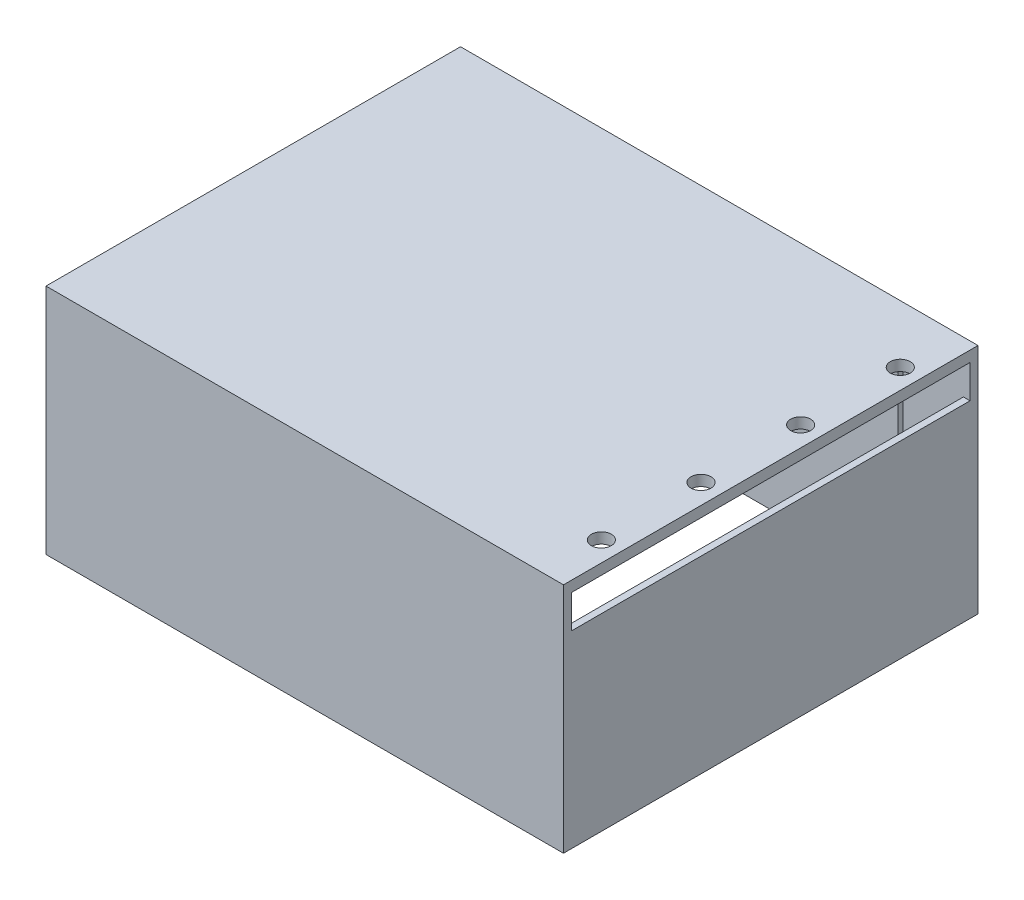
ISO-10303-21;
HEADER;
FILE_DESCRIPTION(('STEP AP214'),'2;1');
FILE_NAME('part.step','',(''),(''),'','','');
FILE_SCHEMA(('AUTOMOTIVE_DESIGN { 1 0 10303 214 1 1 1 1 }'));
ENDSEC;
DATA;
#1=APPLICATION_CONTEXT('core data for automotive mechanical design processes');
#2=APPLICATION_PROTOCOL_DEFINITION('international standard','automotive_design',2000,#1);
#3=PRODUCT_CONTEXT('',#1,'mechanical');
#4=PRODUCT('Part','Part','',(#3));
#5=PRODUCT_RELATED_PRODUCT_CATEGORY('part','',(#4));
#6=PRODUCT_DEFINITION_FORMATION('','',#4);
#7=PRODUCT_DEFINITION_CONTEXT('part definition',#1,'design');
#8=PRODUCT_DEFINITION('design','',#6,#7);
#9=PRODUCT_DEFINITION_SHAPE('','',#8);
#10=(LENGTH_UNIT() NAMED_UNIT(*) SI_UNIT(.MILLI.,.METRE.));
#11=(NAMED_UNIT(*) PLANE_ANGLE_UNIT() SI_UNIT($,.RADIAN.));
#12=(NAMED_UNIT(*) SI_UNIT($,.STERADIAN.) SOLID_ANGLE_UNIT());
#13=UNCERTAINTY_MEASURE_WITH_UNIT(LENGTH_MEASURE(1.E-05),#10,'distance_accuracy_value','');
#14=(GEOMETRIC_REPRESENTATION_CONTEXT(3) GLOBAL_UNCERTAINTY_ASSIGNED_CONTEXT((#13)) GLOBAL_UNIT_ASSIGNED_CONTEXT((#10,
#11,#12)) REPRESENTATION_CONTEXT('',''));
#15=CARTESIAN_POINT('',(0.,0.,0.));
#16=DIRECTION('',(0.,0.,1.));
#17=DIRECTION('',(1.,0.,0.));
#18=AXIS2_PLACEMENT_3D('',#15,#16,#17);
#19=CARTESIAN_POINT('',(0.,0.,0.));
#20=DIRECTION('',(0.,-1.,0.));
#21=DIRECTION('',(0.,0.,-1.));
#22=AXIS2_PLACEMENT_3D('',#19,#20,#21);
#23=PLANE('',#22);
#24=DIRECTION('',(-1.,0.,0.));
#25=VECTOR('',#24,1.);
#26=CARTESIAN_POINT('',(10.,0.,-17.4865255232317));
#27=LINE('',#26,#25);
#28=CARTESIAN_POINT('',(2.,0.,-17.4865255232317));
#29=VERTEX_POINT('',#28);
#30=CARTESIAN_POINT('',(0.,0.,-17.4865255232317));
#31=VERTEX_POINT('',#30);
#32=EDGE_CURVE('E326',#29,#31,#27,.T.);
#33=ORIENTED_EDGE('',*,*,#32,.T.);
#34=DIRECTION('',(0.,0.,1.));
#35=VECTOR('',#34,1.);
#36=CARTESIAN_POINT('',(0.,0.,0.));
#37=LINE('',#36,#35);
#38=CARTESIAN_POINT('',(0.,0.,-35.7665255232317));
#39=VERTEX_POINT('',#38);
#40=EDGE_CURVE('E391',#39,#31,#37,.T.);
#41=ORIENTED_EDGE('',*,*,#40,.F.);
#42=DIRECTION('',(-1.,0.,0.));
#43=VECTOR('',#42,1.);
#44=CARTESIAN_POINT('',(15.,0.,-35.7665255232317));
#45=LINE('',#44,#43);
#46=CARTESIAN_POINT('',(2.,0.,-35.7665255232317));
#47=VERTEX_POINT('',#46);
#48=EDGE_CURVE('E343',#47,#39,#45,.T.);
#49=ORIENTED_EDGE('',*,*,#48,.F.);
#50=DIRECTION('',(0.,0.,-1.));
#51=VECTOR('',#50,1.);
#52=CARTESIAN_POINT('',(2.,0.,0.));
#53=LINE('',#52,#51);
#54=EDGE_CURVE('E369',#29,#47,#53,.T.);
#55=ORIENTED_EDGE('',*,*,#54,.F.);
#56=EDGE_LOOP('',(#33,#41,#49,#55));
#57=FACE_BOUND('',#56,.T.);
#58=ADVANCED_FACE('F46',(#57),#23,.T.);
#59=CARTESIAN_POINT('',(0.,35.,0.));
#60=DIRECTION('',(1.,0.,0.));
#61=DIRECTION('',(0.,0.,-1.));
#62=AXIS2_PLACEMENT_3D('',#59,#60,#61);
#63=PLANE('',#62);
#64=DIRECTION('',(0.,0.,1.));
#65=VECTOR('',#64,1.);
#66=CARTESIAN_POINT('',(0.,9.,-52.4));
#67=LINE('',#66,#65);
#68=CARTESIAN_POINT('',(0.,9.,-52.4));
#69=VERTEX_POINT('',#68);
#70=CARTESIAN_POINT('',(0.,9.,-35.4));
#71=VERTEX_POINT('',#70);
#72=EDGE_CURVE('E300',#69,#71,#67,.T.);
#73=ORIENTED_EDGE('',*,*,#72,.F.);
#74=DIRECTION('',(0.,-1.,0.));
#75=VECTOR('',#74,1.);
#76=CARTESIAN_POINT('',(0.,25.,-52.4));
#77=LINE('',#76,#75);
#78=CARTESIAN_POINT('',(0.,25.,-52.4));
#79=VERTEX_POINT('',#78);
#80=EDGE_CURVE('E293',#79,#69,#77,.T.);
#81=ORIENTED_EDGE('',*,*,#80,.F.);
#82=DIRECTION('',(0.,0.,-1.));
#83=VECTOR('',#82,1.);
#84=CARTESIAN_POINT('',(0.,25.,-52.4));
#85=LINE('',#84,#83);
#86=CARTESIAN_POINT('',(0.,25.,-35.4));
#87=VERTEX_POINT('',#86);
#88=EDGE_CURVE('E306',#87,#79,#85,.T.);
#89=ORIENTED_EDGE('',*,*,#88,.F.);
#90=DIRECTION('',(0.,1.,0.));
#91=VECTOR('',#90,1.);
#92=CARTESIAN_POINT('',(0.,25.,-35.4));
#93=LINE('',#92,#91);
#94=EDGE_CURVE('E303',#71,#87,#93,.T.);
#95=ORIENTED_EDGE('',*,*,#94,.F.);
#96=EDGE_LOOP('',(#73,#81,#89,#95));
#97=FACE_BOUND('',#96,.T.);
#98=ORIENTED_EDGE('',*,*,#40,.T.);
#99=DIRECTION('',(0.,-1.,0.));
#100=VECTOR('',#99,1.);
#101=CARTESIAN_POINT('',(0.,0.,-17.4865255232317));
#102=LINE('',#101,#100);
#103=CARTESIAN_POINT('',(0.,5.15,-17.4865255232317));
#104=VERTEX_POINT('',#103);
#105=EDGE_CURVE('E312',#104,#31,#102,.T.);
#106=ORIENTED_EDGE('',*,*,#105,.F.);
#107=DIRECTION('',(0.,0.,-1.));
#108=VECTOR('',#107,1.);
#109=CARTESIAN_POINT('',(0.,5.15,-17.4865255232317));
#110=LINE('',#109,#108);
#111=CARTESIAN_POINT('',(0.,5.15,-7.52999999999999));
#112=VERTEX_POINT('',#111);
#113=EDGE_CURVE('E323',#112,#104,#110,.T.);
#114=ORIENTED_EDGE('',*,*,#113,.F.);
#115=DIRECTION('',(0.,1.,0.));
#116=VECTOR('',#115,1.);
#117=CARTESIAN_POINT('',(0.,0.,-7.52999999999999));
#118=LINE('',#117,#116);
#119=CARTESIAN_POINT('',(0.,0.,-7.52999999999999));
#120=VERTEX_POINT('',#119);
#121=EDGE_CURVE('E320',#120,#112,#118,.T.);
#122=ORIENTED_EDGE('',*,*,#121,.F.);
#123=CARTESIAN_POINT('',(0.,0.,0.));
#124=VERTEX_POINT('',#123);
#125=EDGE_CURVE('E373',#120,#124,#37,.T.);
#126=ORIENTED_EDGE('',*,*,#125,.T.);
#127=DIRECTION('',(0.,-1.,0.));
#128=VECTOR('',#127,1.);
#129=CARTESIAN_POINT('',(0.,35.,0.));
#130=LINE('',#129,#128);
#131=CARTESIAN_POINT('',(0.,35.,0.));
#132=VERTEX_POINT('',#131);
#133=EDGE_CURVE('E404',#132,#124,#130,.T.);
#134=ORIENTED_EDGE('',*,*,#133,.F.);
#135=DIRECTION('',(0.,0.,1.));
#136=VECTOR('',#135,1.);
#137=CARTESIAN_POINT('',(0.,35.,0.));
#138=LINE('',#137,#136);
#139=CARTESIAN_POINT('',(0.,35.,-62.4));
#140=VERTEX_POINT('',#139);
#141=EDGE_CURVE('E376',#140,#132,#138,.T.);
#142=ORIENTED_EDGE('',*,*,#141,.F.);
#143=DIRECTION('',(0.,-1.,0.));
#144=VECTOR('',#143,1.);
#145=CARTESIAN_POINT('',(0.,35.,-62.4));
#146=LINE('',#145,#144);
#147=CARTESIAN_POINT('',(0.,0.,-62.4));
#148=VERTEX_POINT('',#147);
#149=EDGE_CURVE('E386',#140,#148,#146,.T.);
#150=ORIENTED_EDGE('',*,*,#149,.T.);
#151=CARTESIAN_POINT('',(0.,0.,-48.9));
#152=VERTEX_POINT('',#151);
#153=EDGE_CURVE('E387',#148,#152,#37,.T.);
#154=ORIENTED_EDGE('',*,*,#153,.T.);
#155=DIRECTION('',(0.,-1.,0.));
#156=VECTOR('',#155,1.);
#157=CARTESIAN_POINT('',(0.,0.,-48.9));
#158=LINE('',#157,#156);
#159=CARTESIAN_POINT('',(0.,5.,-48.9));
#160=VERTEX_POINT('',#159);
#161=EDGE_CURVE('E341',#160,#152,#158,.T.);
#162=ORIENTED_EDGE('',*,*,#161,.F.);
#163=DIRECTION('',(0.,0.,-1.));
#164=VECTOR('',#163,1.);
#165=CARTESIAN_POINT('',(0.,5.,-35.7665255232317));
#166=LINE('',#165,#164);
#167=CARTESIAN_POINT('',(0.,5.,-35.7665255232317));
#168=VERTEX_POINT('',#167);
#169=EDGE_CURVE('E338',#168,#160,#166,.T.);
#170=ORIENTED_EDGE('',*,*,#169,.F.);
#171=DIRECTION('',(0.,1.,0.));
#172=VECTOR('',#171,1.);
#173=CARTESIAN_POINT('',(0.,0.,-35.7665255232317));
#174=LINE('',#173,#172);
#175=EDGE_CURVE('E329',#39,#168,#174,.T.);
#176=ORIENTED_EDGE('',*,*,#175,.F.);
#177=EDGE_LOOP('',(#98,#106,#114,#122,#126,#134,#142,#150,#154,#162,#170,#176));
#178=FACE_BOUND('',#177,.T.);
#179=ADVANCED_FACE('F48',(#97,#178),#63,.F.);
#180=CARTESIAN_POINT('',(0.,35.,0.));
#181=DIRECTION('',(0.,0.,-1.));
#182=DIRECTION('',(-1.,0.,0.));
#183=AXIS2_PLACEMENT_3D('',#180,#181,#182);
#184=PLANE('',#183);
#185=DIRECTION('',(1.,0.,0.));
#186=VECTOR('',#185,1.);
#187=CARTESIAN_POINT('',(0.,0.,0.));
#188=LINE('',#187,#186);
#189=CARTESIAN_POINT('',(77.9,0.,0.));
#190=VERTEX_POINT('',#189);
#191=EDGE_CURVE('E390',#124,#190,#188,.T.);
#192=ORIENTED_EDGE('',*,*,#191,.T.);
#193=DIRECTION('',(0.,-1.,0.));
#194=VECTOR('',#193,1.);
#195=CARTESIAN_POINT('',(77.9,35.,0.));
#196=LINE('',#195,#194);
#197=CARTESIAN_POINT('',(77.9,35.,0.));
#198=VERTEX_POINT('',#197);
#199=EDGE_CURVE('E401',#198,#190,#196,.T.);
#200=ORIENTED_EDGE('',*,*,#199,.F.);
#201=DIRECTION('',(1.,0.,0.));
#202=VECTOR('',#201,1.);
#203=CARTESIAN_POINT('',(0.,35.,0.));
#204=LINE('',#203,#202);
#205=EDGE_CURVE('E379',#132,#198,#204,.T.);
#206=ORIENTED_EDGE('',*,*,#205,.F.);
#207=ORIENTED_EDGE('',*,*,#133,.T.);
#208=EDGE_LOOP('',(#192,#200,#206,#207));
#209=FACE_BOUND('',#208,.T.);
#210=ADVANCED_FACE('F461',(#209),#184,.F.);
#211=CARTESIAN_POINT('',(77.9,35.,0.));
#212=DIRECTION('',(-1.,0.,0.));
#213=DIRECTION('',(0.,0.,1.));
#214=AXIS2_PLACEMENT_3D('',#211,#212,#213);
#215=PLANE('',#214);
#216=DIRECTION('',(0.,0.,1.));
#217=VECTOR('',#216,1.);
#218=CARTESIAN_POINT('',(77.9,33.39,-61.2));
#219=LINE('',#218,#217);
#220=CARTESIAN_POINT('',(77.9,33.39,-61.2));
#221=VERTEX_POINT('',#220);
#222=CARTESIAN_POINT('',(77.9,33.39,-1.20000000000001));
#223=VERTEX_POINT('',#222);
#224=EDGE_CURVE('E281',#221,#223,#219,.T.);
#225=ORIENTED_EDGE('',*,*,#224,.F.);
#226=DIRECTION('',(0.,1.,0.));
#227=VECTOR('',#226,1.);
#228=CARTESIAN_POINT('',(77.9,33.39,-61.2));
#229=LINE('',#228,#227);
#230=CARTESIAN_POINT('',(77.9,28.39,-61.2));
#231=VERTEX_POINT('',#230);
#232=EDGE_CURVE('E278',#231,#221,#229,.T.);
#233=ORIENTED_EDGE('',*,*,#232,.F.);
#234=DIRECTION('',(0.,0.,-1.));
#235=VECTOR('',#234,1.);
#236=CARTESIAN_POINT('',(77.9,28.39,-61.2));
#237=LINE('',#236,#235);
#238=CARTESIAN_POINT('',(77.9,28.39,-1.20000000000001));
#239=VERTEX_POINT('',#238);
#240=EDGE_CURVE('E287',#239,#231,#237,.T.);
#241=ORIENTED_EDGE('',*,*,#240,.F.);
#242=DIRECTION('',(0.,-1.,0.));
#243=VECTOR('',#242,1.);
#244=CARTESIAN_POINT('',(77.9,33.39,-1.20000000000001));
#245=LINE('',#244,#243);
#246=EDGE_CURVE('E284',#223,#239,#245,.T.);
#247=ORIENTED_EDGE('',*,*,#246,.F.);
#248=EDGE_LOOP('',(#225,#233,#241,#247));
#249=FACE_BOUND('',#248,.T.);
#250=DIRECTION('',(0.,0.,-1.));
#251=VECTOR('',#250,1.);
#252=CARTESIAN_POINT('',(77.9,0.,0.));
#253=LINE('',#252,#251);
#254=CARTESIAN_POINT('',(77.9,0.,-62.4));
#255=VERTEX_POINT('',#254);
#256=EDGE_CURVE('E393',#190,#255,#253,.T.);
#257=ORIENTED_EDGE('',*,*,#256,.T.);
#258=DIRECTION('',(0.,-1.,0.));
#259=VECTOR('',#258,1.);
#260=CARTESIAN_POINT('',(77.9,35.,-62.4));
#261=LINE('',#260,#259);
#262=CARTESIAN_POINT('',(77.9,35.,-62.4));
#263=VERTEX_POINT('',#262);
#264=EDGE_CURVE('E398',#263,#255,#261,.T.);
#265=ORIENTED_EDGE('',*,*,#264,.F.);
#266=DIRECTION('',(0.,0.,-1.));
#267=VECTOR('',#266,1.);
#268=CARTESIAN_POINT('',(77.9,35.,0.));
#269=LINE('',#268,#267);
#270=EDGE_CURVE('E382',#198,#263,#269,.T.);
#271=ORIENTED_EDGE('',*,*,#270,.F.);
#272=ORIENTED_EDGE('',*,*,#199,.T.);
#273=EDGE_LOOP('',(#257,#265,#271,#272));
#274=FACE_BOUND('',#273,.T.);
#275=ADVANCED_FACE('F479',(#249,#274),#215,.F.);
#276=CARTESIAN_POINT('',(0.,35.,-62.4));
#277=DIRECTION('',(0.,0.,1.));
#278=DIRECTION('',(1.,0.,0.));
#279=AXIS2_PLACEMENT_3D('',#276,#277,#278);
#280=PLANE('',#279);
#281=DIRECTION('',(-1.,0.,0.));
#282=VECTOR('',#281,1.);
#283=CARTESIAN_POINT('',(0.,0.,-62.4));
#284=LINE('',#283,#282);
#285=EDGE_CURVE('E380',#255,#148,#284,.T.);
#286=ORIENTED_EDGE('',*,*,#285,.T.);
#287=ORIENTED_EDGE('',*,*,#149,.F.);
#288=DIRECTION('',(-1.,0.,0.));
#289=VECTOR('',#288,1.);
#290=CARTESIAN_POINT('',(0.,35.,-62.4));
#291=LINE('',#290,#289);
#292=EDGE_CURVE('E384',#263,#140,#291,.T.);
#293=ORIENTED_EDGE('',*,*,#292,.F.);
#294=ORIENTED_EDGE('',*,*,#264,.T.);
#295=EDGE_LOOP('',(#286,#287,#293,#294));
#296=FACE_BOUND('',#295,.T.);
#297=ADVANCED_FACE('F474',(#296),#280,.F.);
#298=CARTESIAN_POINT('',(0.,35.,0.));
#299=DIRECTION('',(0.,-1.,0.));
#300=DIRECTION('',(0.,0.,-1.));
#301=AXIS2_PLACEMENT_3D('',#298,#299,#300);
#302=PLANE('',#301);
#303=CARTESIAN_POINT('',(74.9,35.,-8.7));
#304=DIRECTION('',(0.,-1.,0.));
#305=DIRECTION('',(0.,0.,-1.));
#306=AXIS2_PLACEMENT_3D('',#303,#304,#305);
#307=CIRCLE('',#306,1.5);
#308=CARTESIAN_POINT('',(74.9,35.,-10.2));
#309=VERTEX_POINT('',#308);
#310=EDGE_CURVE('E243',#309,#309,#307,.T.);
#311=ORIENTED_EDGE('',*,*,#310,.T.);
#312=EDGE_LOOP('',(#311));
#313=FACE_BOUND('',#312,.T.);
#314=CARTESIAN_POINT('',(74.9,35.,-23.7));
#315=DIRECTION('',(0.,-1.,0.));
#316=DIRECTION('',(0.,0.,-1.));
#317=AXIS2_PLACEMENT_3D('',#314,#315,#316);
#318=CIRCLE('',#317,1.5);
#319=CARTESIAN_POINT('',(74.9,35.,-25.2));
#320=VERTEX_POINT('',#319);
#321=EDGE_CURVE('E606',#320,#320,#318,.T.);
#322=ORIENTED_EDGE('',*,*,#321,.T.);
#323=EDGE_LOOP('',(#322));
#324=FACE_BOUND('',#323,.T.);
#325=CARTESIAN_POINT('',(74.9,35.,-38.7));
#326=DIRECTION('',(0.,-1.,0.));
#327=DIRECTION('',(0.,0.,-1.));
#328=AXIS2_PLACEMENT_3D('',#325,#326,#327);
#329=CIRCLE('',#328,1.5);
#330=CARTESIAN_POINT('',(74.9,35.,-40.2));
#331=VERTEX_POINT('',#330);
#332=EDGE_CURVE('E603',#331,#331,#329,.T.);
#333=ORIENTED_EDGE('',*,*,#332,.T.);
#334=EDGE_LOOP('',(#333));
#335=FACE_BOUND('',#334,.T.);
#336=CARTESIAN_POINT('',(74.9,35.,-53.7));
#337=DIRECTION('',(0.,-1.,0.));
#338=DIRECTION('',(0.,0.,-1.));
#339=AXIS2_PLACEMENT_3D('',#336,#337,#338);
#340=CIRCLE('',#339,1.5);
#341=CARTESIAN_POINT('',(74.9,35.,-55.2));
#342=VERTEX_POINT('',#341);
#343=EDGE_CURVE('E592',#342,#342,#340,.T.);
#344=ORIENTED_EDGE('',*,*,#343,.T.);
#345=EDGE_LOOP('',(#344));
#346=FACE_BOUND('',#345,.T.);
#347=ORIENTED_EDGE('',*,*,#141,.T.);
#348=ORIENTED_EDGE('',*,*,#205,.T.);
#349=ORIENTED_EDGE('',*,*,#270,.T.);
#350=ORIENTED_EDGE('',*,*,#292,.T.);
#351=EDGE_LOOP('',(#347,#348,#349,#350));
#352=FACE_BOUND('',#351,.T.);
#353=ADVANCED_FACE('F467',(#313,#324,#335,#346,#352),#302,.F.);
#354=DIRECTION('',(-1.,0.,0.));
#355=VECTOR('',#354,1.);
#356=CARTESIAN_POINT('',(76.9,0.,-1.20000000000001));
#357=LINE('',#356,#355);
#358=CARTESIAN_POINT('',(75.294254170899,0.,-1.20000000000001));
#359=VERTEX_POINT('',#358);
#360=CARTESIAN_POINT('',(67.8234145179937,0.,-1.20000000000001));
#361=VERTEX_POINT('',#360);
#362=EDGE_CURVE('E232',#359,#361,#357,.T.);
#363=ORIENTED_EDGE('',*,*,#362,.F.);
#364=DIRECTION('',(0.,0.,-1.));
#365=VECTOR('',#364,1.);
#366=CARTESIAN_POINT('',(75.294254170899,0.,-1.20000000000001));
#367=LINE('',#366,#365);
#368=CARTESIAN_POINT('',(75.294254170899,0.,-61.2));
#369=VERTEX_POINT('',#368);
#370=EDGE_CURVE('E434',#359,#369,#367,.T.);
#371=ORIENTED_EDGE('',*,*,#370,.T.);
#372=DIRECTION('',(1.,0.,0.));
#373=VECTOR('',#372,1.);
#374=CARTESIAN_POINT('',(76.9,0.,-61.2));
#375=LINE('',#374,#373);
#376=CARTESIAN_POINT('',(67.8234145179937,0.,-61.2));
#377=VERTEX_POINT('',#376);
#378=EDGE_CURVE('E68',#377,#369,#375,.T.);
#379=ORIENTED_EDGE('',*,*,#378,.F.);
#380=DIRECTION('',(0.,0.,-1.));
#381=VECTOR('',#380,1.);
#382=CARTESIAN_POINT('',(67.8234145179937,0.,-61.2));
#383=LINE('',#382,#381);
#384=CARTESIAN_POINT('',(67.8234145179937,0.,-60.4));
#385=VERTEX_POINT('',#384);
#386=EDGE_CURVE('E242',#385,#377,#383,.T.);
#387=ORIENTED_EDGE('',*,*,#386,.F.);
#388=DIRECTION('',(1.,0.,0.));
#389=VECTOR('',#388,1.);
#390=CARTESIAN_POINT('',(0.,0.,-60.4));
#391=LINE('',#390,#389);
#392=CARTESIAN_POINT('',(2.,0.,-60.4));
#393=VERTEX_POINT('',#392);
#394=EDGE_CURVE('E347',#393,#385,#391,.T.);
#395=ORIENTED_EDGE('',*,*,#394,.F.);
#396=CARTESIAN_POINT('',(2.,0.,-48.9));
#397=VERTEX_POINT('',#396);
#398=EDGE_CURVE('E366',#397,#393,#53,.T.);
#399=ORIENTED_EDGE('',*,*,#398,.F.);
#400=DIRECTION('',(-1.,0.,0.));
#401=VECTOR('',#400,1.);
#402=CARTESIAN_POINT('',(15.,0.,-48.9));
#403=LINE('',#402,#401);
#404=EDGE_CURVE('E344',#397,#152,#403,.T.);
#405=ORIENTED_EDGE('',*,*,#404,.T.);
#406=ORIENTED_EDGE('',*,*,#153,.F.);
#407=ORIENTED_EDGE('',*,*,#285,.F.);
#408=ORIENTED_EDGE('',*,*,#256,.F.);
#409=ORIENTED_EDGE('',*,*,#191,.F.);
#410=ORIENTED_EDGE('',*,*,#125,.F.);
#411=DIRECTION('',(-1.,0.,0.));
#412=VECTOR('',#411,1.);
#413=CARTESIAN_POINT('',(10.,0.,-7.52999999999999));
#414=LINE('',#413,#412);
#415=CARTESIAN_POINT('',(2.,0.,-7.52999999999999));
#416=VERTEX_POINT('',#415);
#417=EDGE_CURVE('E332',#416,#120,#414,.T.);
#418=ORIENTED_EDGE('',*,*,#417,.F.);
#419=CARTESIAN_POINT('',(2.,0.,-2.));
#420=VERTEX_POINT('',#419);
#421=EDGE_CURVE('E357',#420,#416,#53,.T.);
#422=ORIENTED_EDGE('',*,*,#421,.F.);
#423=DIRECTION('',(-1.,0.,0.));
#424=VECTOR('',#423,1.);
#425=CARTESIAN_POINT('',(0.,0.,-2.));
#426=LINE('',#425,#424);
#427=CARTESIAN_POINT('',(67.8234145179937,0.,-2.00000000000002));
#428=VERTEX_POINT('',#427);
#429=EDGE_CURVE('E258',#428,#420,#426,.T.);
#430=ORIENTED_EDGE('',*,*,#429,.F.);
#431=EDGE_CURVE('E248',#361,#428,#383,.T.);
#432=ORIENTED_EDGE('',*,*,#431,.F.);
#433=EDGE_LOOP('',(#363,#371,#379,#387,#395,#399,#405,#406,#407,#408,#409,#410,#418,#422,#430,#432));
#434=FACE_BOUND('',#433,.T.);
#435=ADVANCED_FACE('F256',(#434),#23,.T.);
#436=CARTESIAN_POINT('',(0.,33.39,-60.4));
#437=DIRECTION('',(0.,0.,-1.));
#438=DIRECTION('',(-1.,0.,0.));
#439=AXIS2_PLACEMENT_3D('',#436,#437,#438);
#440=PLANE('',#439);
#441=ORIENTED_EDGE('',*,*,#394,.T.);
#442=DIRECTION('',(0.,1.,0.));
#443=VECTOR('',#442,1.);
#444=CARTESIAN_POINT('',(67.8234145179937,33.39,-60.4));
#445=LINE('',#444,#443);
#446=CARTESIAN_POINT('',(67.8234145179937,33.39,-60.4));
#447=VERTEX_POINT('',#446);
#448=EDGE_CURVE('E275',#385,#447,#445,.T.);
#449=ORIENTED_EDGE('',*,*,#448,.T.);
#450=DIRECTION('',(1.,0.,0.));
#451=VECTOR('',#450,1.);
#452=CARTESIAN_POINT('',(0.,33.39,-60.4));
#453=LINE('',#452,#451);
#454=CARTESIAN_POINT('',(2.,33.39,-60.4));
#455=VERTEX_POINT('',#454);
#456=EDGE_CURVE('E353',#455,#447,#453,.T.);
#457=ORIENTED_EDGE('',*,*,#456,.F.);
#458=DIRECTION('',(0.,-1.,0.));
#459=VECTOR('',#458,1.);
#460=CARTESIAN_POINT('',(2.,33.39,-60.4));
#461=LINE('',#460,#459);
#462=EDGE_CURVE('E370',#455,#393,#461,.T.);
#463=ORIENTED_EDGE('',*,*,#462,.T.);
#464=EDGE_LOOP('',(#441,#449,#457,#463));
#465=FACE_BOUND('',#464,.T.);
#466=ADVANCED_FACE('F466',(#465),#440,.F.);
#467=CARTESIAN_POINT('',(2.,33.39,0.));
#468=DIRECTION('',(-1.,0.,0.));
#469=DIRECTION('',(0.,0.,1.));
#470=AXIS2_PLACEMENT_3D('',#467,#468,#469);
#471=PLANE('',#470);
#472=CARTESIAN_POINT('',(2.,2.5,-31.2));
#473=DIRECTION('',(-1.,0.,0.));
#474=DIRECTION('',(0.,0.,1.));
#475=AXIS2_PLACEMENT_3D('',#472,#473,#474);
#476=CIRCLE('',#475,1.);
#477=CARTESIAN_POINT('',(2.,2.5,-30.2));
#478=VERTEX_POINT('',#477);
#479=EDGE_CURVE('E50',#478,#478,#476,.T.);
#480=ORIENTED_EDGE('',*,*,#479,.T.);
#481=EDGE_LOOP('',(#480));
#482=FACE_BOUND('',#481,.T.);
#483=DIRECTION('',(0.,0.,-1.));
#484=VECTOR('',#483,1.);
#485=CARTESIAN_POINT('',(2.,25.,0.));
#486=LINE('',#485,#484);
#487=CARTESIAN_POINT('',(2.,25.,-35.4));
#488=VERTEX_POINT('',#487);
#489=CARTESIAN_POINT('',(2.,25.,-52.4));
#490=VERTEX_POINT('',#489);
#491=EDGE_CURVE('E55',#488,#490,#486,.T.);
#492=ORIENTED_EDGE('',*,*,#491,.T.);
#493=DIRECTION('',(0.,-1.,0.));
#494=VECTOR('',#493,1.);
#495=CARTESIAN_POINT('',(2.,33.39,-52.4));
#496=LINE('',#495,#494);
#497=CARTESIAN_POINT('',(2.,9.,-52.4));
#498=VERTEX_POINT('',#497);
#499=EDGE_CURVE('E13',#490,#498,#496,.T.);
#500=ORIENTED_EDGE('',*,*,#499,.T.);
#501=DIRECTION('',(0.,0.,1.));
#502=VECTOR('',#501,1.);
#503=CARTESIAN_POINT('',(2.,9.00000000000001,0.));
#504=LINE('',#503,#502);
#505=CARTESIAN_POINT('',(2.,9.,-35.4));
#506=VERTEX_POINT('',#505);
#507=EDGE_CURVE('E425',#498,#506,#504,.T.);
#508=ORIENTED_EDGE('',*,*,#507,.T.);
#509=DIRECTION('',(0.,1.,0.));
#510=VECTOR('',#509,1.);
#511=CARTESIAN_POINT('',(2.,33.39,-35.4));
#512=LINE('',#511,#510);
#513=EDGE_CURVE('E428',#506,#488,#512,.T.);
#514=ORIENTED_EDGE('',*,*,#513,.T.);
#515=EDGE_LOOP('',(#492,#500,#508,#514));
#516=FACE_BOUND('',#515,.T.);
#517=DIRECTION('',(0.,0.,-1.));
#518=VECTOR('',#517,1.);
#519=CARTESIAN_POINT('',(2.,5.15,0.));
#520=LINE('',#519,#518);
#521=CARTESIAN_POINT('',(2.,5.15,-7.52999999999999));
#522=VERTEX_POINT('',#521);
#523=CARTESIAN_POINT('',(2.,5.15,-17.4865255232317));
#524=VERTEX_POINT('',#523);
#525=EDGE_CURVE('E419',#522,#524,#520,.T.);
#526=ORIENTED_EDGE('',*,*,#525,.T.);
#527=DIRECTION('',(0.,-1.,0.));
#528=VECTOR('',#527,1.);
#529=CARTESIAN_POINT('',(2.,33.39,-17.4865255232317));
#530=LINE('',#529,#528);
#531=EDGE_CURVE('E422',#524,#29,#530,.T.);
#532=ORIENTED_EDGE('',*,*,#531,.T.);
#533=ORIENTED_EDGE('',*,*,#54,.T.);
#534=DIRECTION('',(0.,1.,0.));
#535=VECTOR('',#534,1.);
#536=CARTESIAN_POINT('',(2.,33.39,-35.7665255232317));
#537=LINE('',#536,#535);
#538=CARTESIAN_POINT('',(2.,5.,-35.7665255232317));
#539=VERTEX_POINT('',#538);
#540=EDGE_CURVE('E407',#47,#539,#537,.T.);
#541=ORIENTED_EDGE('',*,*,#540,.T.);
#542=DIRECTION('',(0.,0.,-1.));
#543=VECTOR('',#542,1.);
#544=CARTESIAN_POINT('',(2.,5.,0.));
#545=LINE('',#544,#543);
#546=CARTESIAN_POINT('',(2.,5.,-48.9));
#547=VERTEX_POINT('',#546);
#548=EDGE_CURVE('E410',#539,#547,#545,.T.);
#549=ORIENTED_EDGE('',*,*,#548,.T.);
#550=DIRECTION('',(0.,-1.,0.));
#551=VECTOR('',#550,1.);
#552=CARTESIAN_POINT('',(2.,33.39,-48.9));
#553=LINE('',#552,#551);
#554=EDGE_CURVE('E413',#547,#397,#553,.T.);
#555=ORIENTED_EDGE('',*,*,#554,.T.);
#556=ORIENTED_EDGE('',*,*,#398,.T.);
#557=ORIENTED_EDGE('',*,*,#462,.F.);
#558=DIRECTION('',(0.,0.,-1.));
#559=VECTOR('',#558,1.);
#560=CARTESIAN_POINT('',(2.,33.39,0.));
#561=LINE('',#560,#559);
#562=CARTESIAN_POINT('',(2.,33.39,-2.));
#563=VERTEX_POINT('',#562);
#564=EDGE_CURVE('E359',#563,#455,#561,.T.);
#565=ORIENTED_EDGE('',*,*,#564,.F.);
#566=DIRECTION('',(0.,-1.,0.));
#567=VECTOR('',#566,1.);
#568=CARTESIAN_POINT('',(2.,33.39,-2.));
#569=LINE('',#568,#567);
#570=EDGE_CURVE('E362',#563,#420,#569,.T.);
#571=ORIENTED_EDGE('',*,*,#570,.T.);
#572=ORIENTED_EDGE('',*,*,#421,.T.);
#573=DIRECTION('',(0.,1.,0.));
#574=VECTOR('',#573,1.);
#575=CARTESIAN_POINT('',(2.,33.39,-7.52999999999999));
#576=LINE('',#575,#574);
#577=EDGE_CURVE('E416',#416,#522,#576,.T.);
#578=ORIENTED_EDGE('',*,*,#577,.T.);
#579=EDGE_LOOP('',(#526,#532,#533,#541,#549,#555,#556,#557,#565,#571,#572,#578));
#580=FACE_BOUND('',#579,.T.);
#581=ADVANCED_FACE('F442',(#482,#516,#580),#471,.F.);
#582=CARTESIAN_POINT('',(0.,33.39,-2.));
#583=DIRECTION('',(0.,0.,1.));
#584=DIRECTION('',(1.,0.,0.));
#585=AXIS2_PLACEMENT_3D('',#582,#583,#584);
#586=PLANE('',#585);
#587=DIRECTION('',(-1.,0.,0.));
#588=VECTOR('',#587,1.);
#589=CARTESIAN_POINT('',(0.,33.39,-2.));
#590=LINE('',#589,#588);
#591=CARTESIAN_POINT('',(67.8234145179937,33.39,-2.));
#592=VERTEX_POINT('',#591);
#593=EDGE_CURVE('E356',#592,#563,#590,.T.);
#594=ORIENTED_EDGE('',*,*,#593,.F.);
#595=DIRECTION('',(0.,-1.,0.));
#596=VECTOR('',#595,1.);
#597=CARTESIAN_POINT('',(67.8234145179937,33.39,-2.));
#598=LINE('',#597,#596);
#599=EDGE_CURVE('E272',#592,#428,#598,.T.);
#600=ORIENTED_EDGE('',*,*,#599,.T.);
#601=ORIENTED_EDGE('',*,*,#429,.T.);
#602=ORIENTED_EDGE('',*,*,#570,.F.);
#603=EDGE_LOOP('',(#594,#600,#601,#602));
#604=FACE_BOUND('',#603,.T.);
#605=ADVANCED_FACE('F484',(#604),#586,.F.);
#606=CARTESIAN_POINT('',(0.,33.39,0.));
#607=DIRECTION('',(0.,-1.,0.));
#608=DIRECTION('',(0.,0.,-1.));
#609=AXIS2_PLACEMENT_3D('',#606,#607,#608);
#610=PLANE('',#609);
#611=CARTESIAN_POINT('',(74.9,33.39,-8.7));
#612=DIRECTION('',(0.,-1.,0.));
#613=DIRECTION('',(0.,0.,-1.));
#614=AXIS2_PLACEMENT_3D('',#611,#612,#613);
#615=CIRCLE('',#614,1.5);
#616=CARTESIAN_POINT('',(74.9,33.39,-10.2));
#617=VERTEX_POINT('',#616);
#618=EDGE_CURVE('E589',#617,#617,#615,.T.);
#619=ORIENTED_EDGE('',*,*,#618,.F.);
#620=EDGE_LOOP('',(#619));
#621=FACE_BOUND('',#620,.T.);
#622=CARTESIAN_POINT('',(74.9,33.39,-23.7));
#623=DIRECTION('',(0.,-1.,0.));
#624=DIRECTION('',(0.,0.,-1.));
#625=AXIS2_PLACEMENT_3D('',#622,#623,#624);
#626=CIRCLE('',#625,1.5);
#627=CARTESIAN_POINT('',(74.9,33.39,-25.2));
#628=VERTEX_POINT('',#627);
#629=EDGE_CURVE('E593',#628,#628,#626,.T.);
#630=ORIENTED_EDGE('',*,*,#629,.F.);
#631=EDGE_LOOP('',(#630));
#632=FACE_BOUND('',#631,.T.);
#633=CARTESIAN_POINT('',(74.9,33.39,-38.7));
#634=DIRECTION('',(0.,-1.,0.));
#635=DIRECTION('',(0.,0.,-1.));
#636=AXIS2_PLACEMENT_3D('',#633,#634,#635);
#637=CIRCLE('',#636,1.5);
#638=CARTESIAN_POINT('',(74.9,33.39,-40.2));
#639=VERTEX_POINT('',#638);
#640=EDGE_CURVE('E596',#639,#639,#637,.T.);
#641=ORIENTED_EDGE('',*,*,#640,.F.);
#642=EDGE_LOOP('',(#641));
#643=FACE_BOUND('',#642,.T.);
#644=CARTESIAN_POINT('',(74.9,33.39,-53.7));
#645=DIRECTION('',(0.,-1.,0.));
#646=DIRECTION('',(0.,0.,-1.));
#647=AXIS2_PLACEMENT_3D('',#644,#645,#646);
#648=CIRCLE('',#647,1.5);
#649=CARTESIAN_POINT('',(74.9,33.39,-55.2));
#650=VERTEX_POINT('',#649);
#651=EDGE_CURVE('E587',#650,#650,#648,.T.);
#652=ORIENTED_EDGE('',*,*,#651,.F.);
#653=EDGE_LOOP('',(#652));
#654=FACE_BOUND('',#653,.T.);
#655=ORIENTED_EDGE('',*,*,#456,.T.);
#656=DIRECTION('',(0.,0.,1.));
#657=VECTOR('',#656,1.);
#658=CARTESIAN_POINT('',(67.8234145179937,33.39,-61.2));
#659=LINE('',#658,#657);
#660=CARTESIAN_POINT('',(67.8234145179937,33.39,-61.2));
#661=VERTEX_POINT('',#660);
#662=EDGE_CURVE('E273',#661,#447,#659,.T.);
#663=ORIENTED_EDGE('',*,*,#662,.F.);
#664=DIRECTION('',(1.,0.,0.));
#665=VECTOR('',#664,1.);
#666=CARTESIAN_POINT('',(67.9,33.39,-61.2));
#667=LINE('',#666,#665);
#668=EDGE_CURVE('E290',#661,#221,#667,.T.);
#669=ORIENTED_EDGE('',*,*,#668,.T.);
#670=ORIENTED_EDGE('',*,*,#224,.T.);
#671=DIRECTION('',(1.,0.,0.));
#672=VECTOR('',#671,1.);
#673=CARTESIAN_POINT('',(67.9,33.39,-1.20000000000001));
#674=LINE('',#673,#672);
#675=CARTESIAN_POINT('',(67.8234145179937,33.39,-1.20000000000001));
#676=VERTEX_POINT('',#675);
#677=EDGE_CURVE('E296',#676,#223,#674,.T.);
#678=ORIENTED_EDGE('',*,*,#677,.F.);
#679=EDGE_CURVE('E251',#592,#676,#659,.T.);
#680=ORIENTED_EDGE('',*,*,#679,.F.);
#681=ORIENTED_EDGE('',*,*,#593,.T.);
#682=ORIENTED_EDGE('',*,*,#564,.T.);
#683=EDGE_LOOP('',(#655,#663,#669,#670,#678,#680,#681,#682));
#684=FACE_BOUND('',#683,.T.);
#685=ADVANCED_FACE('F487',(#621,#632,#643,#654,#684),#610,.T.);
#686=CARTESIAN_POINT('',(15.,0.,-48.9));
#687=DIRECTION('',(0.,0.,-1.));
#688=DIRECTION('',(-1.,0.,0.));
#689=AXIS2_PLACEMENT_3D('',#686,#687,#688);
#690=PLANE('',#689);
#691=DIRECTION('',(-1.,0.,0.));
#692=VECTOR('',#691,1.);
#693=CARTESIAN_POINT('',(15.,5.,-48.9));
#694=LINE('',#693,#692);
#695=EDGE_CURVE('E348',#547,#160,#694,.T.);
#696=ORIENTED_EDGE('',*,*,#695,.T.);
#697=ORIENTED_EDGE('',*,*,#161,.T.);
#698=ORIENTED_EDGE('',*,*,#404,.F.);
#699=ORIENTED_EDGE('',*,*,#554,.F.);
#700=EDGE_LOOP('',(#696,#697,#698,#699));
#701=FACE_BOUND('',#700,.T.);
#702=ADVANCED_FACE('F493',(#701),#690,.F.);
#703=CARTESIAN_POINT('',(15.,5.,-35.7665255232317));
#704=DIRECTION('',(0.,1.,0.));
#705=DIRECTION('',(0.,0.,1.));
#706=AXIS2_PLACEMENT_3D('',#703,#704,#705);
#707=PLANE('',#706);
#708=DIRECTION('',(-1.,0.,0.));
#709=VECTOR('',#708,1.);
#710=CARTESIAN_POINT('',(15.,5.,-35.7665255232317));
#711=LINE('',#710,#709);
#712=EDGE_CURVE('E350',#539,#168,#711,.T.);
#713=ORIENTED_EDGE('',*,*,#712,.T.);
#714=ORIENTED_EDGE('',*,*,#169,.T.);
#715=ORIENTED_EDGE('',*,*,#695,.F.);
#716=ORIENTED_EDGE('',*,*,#548,.F.);
#717=EDGE_LOOP('',(#713,#714,#715,#716));
#718=FACE_BOUND('',#717,.T.);
#719=ADVANCED_FACE('F499',(#718),#707,.F.);
#720=CARTESIAN_POINT('',(15.,0.,-35.7665255232317));
#721=DIRECTION('',(0.,0.,1.));
#722=DIRECTION('',(0.,-1.,0.));
#723=AXIS2_PLACEMENT_3D('',#720,#721,#722);
#724=PLANE('',#723);
#725=ORIENTED_EDGE('',*,*,#48,.T.);
#726=ORIENTED_EDGE('',*,*,#175,.T.);
#727=ORIENTED_EDGE('',*,*,#712,.F.);
#728=ORIENTED_EDGE('',*,*,#540,.F.);
#729=EDGE_LOOP('',(#725,#726,#727,#728));
#730=FACE_BOUND('',#729,.T.);
#731=ADVANCED_FACE('F495',(#730),#724,.F.);
#732=CARTESIAN_POINT('',(10.,0.,-17.4865255232317));
#733=DIRECTION('',(0.,0.,-1.));
#734=DIRECTION('',(-1.,0.,0.));
#735=AXIS2_PLACEMENT_3D('',#732,#733,#734);
#736=PLANE('',#735);
#737=DIRECTION('',(-1.,0.,0.));
#738=VECTOR('',#737,1.);
#739=CARTESIAN_POINT('',(10.,5.15,-17.4865255232317));
#740=LINE('',#739,#738);
#741=EDGE_CURVE('E327',#524,#104,#740,.T.);
#742=ORIENTED_EDGE('',*,*,#741,.T.);
#743=ORIENTED_EDGE('',*,*,#105,.T.);
#744=ORIENTED_EDGE('',*,*,#32,.F.);
#745=ORIENTED_EDGE('',*,*,#531,.F.);
#746=EDGE_LOOP('',(#742,#743,#744,#745));
#747=FACE_BOUND('',#746,.T.);
#748=ADVANCED_FACE('F498',(#747),#736,.F.);
#749=CARTESIAN_POINT('',(10.,5.15,-17.4865255232317));
#750=DIRECTION('',(0.,1.,0.));
#751=DIRECTION('',(0.,0.,1.));
#752=AXIS2_PLACEMENT_3D('',#749,#750,#751);
#753=PLANE('',#752);
#754=DIRECTION('',(-1.,0.,0.));
#755=VECTOR('',#754,1.);
#756=CARTESIAN_POINT('',(10.,5.15,-7.52999999999999));
#757=LINE('',#756,#755);
#758=EDGE_CURVE('E330',#522,#112,#757,.T.);
#759=ORIENTED_EDGE('',*,*,#758,.T.);
#760=ORIENTED_EDGE('',*,*,#113,.T.);
#761=ORIENTED_EDGE('',*,*,#741,.F.);
#762=ORIENTED_EDGE('',*,*,#525,.F.);
#763=EDGE_LOOP('',(#759,#760,#761,#762));
#764=FACE_BOUND('',#763,.T.);
#765=ADVANCED_FACE('F509',(#764),#753,.F.);
#766=CARTESIAN_POINT('',(10.,0.,-7.52999999999999));
#767=DIRECTION('',(0.,0.,1.));
#768=DIRECTION('',(1.,0.,0.));
#769=AXIS2_PLACEMENT_3D('',#766,#767,#768);
#770=PLANE('',#769);
#771=ORIENTED_EDGE('',*,*,#417,.T.);
#772=ORIENTED_EDGE('',*,*,#121,.T.);
#773=ORIENTED_EDGE('',*,*,#758,.F.);
#774=ORIENTED_EDGE('',*,*,#577,.F.);
#775=EDGE_LOOP('',(#771,#772,#773,#774));
#776=FACE_BOUND('',#775,.T.);
#777=ADVANCED_FACE('F511',(#776),#770,.F.);
#778=CARTESIAN_POINT('',(10.,25.,-52.4));
#779=DIRECTION('',(0.,0.,-1.));
#780=DIRECTION('',(-1.,0.,0.));
#781=AXIS2_PLACEMENT_3D('',#778,#779,#780);
#782=PLANE('',#781);
#783=DIRECTION('',(-1.,0.,0.));
#784=VECTOR('',#783,1.);
#785=CARTESIAN_POINT('',(10.,25.,-52.4));
#786=LINE('',#785,#784);
#787=EDGE_CURVE('E310',#490,#79,#786,.T.);
#788=ORIENTED_EDGE('',*,*,#787,.T.);
#789=ORIENTED_EDGE('',*,*,#80,.T.);
#790=DIRECTION('',(-1.,0.,0.));
#791=VECTOR('',#790,1.);
#792=CARTESIAN_POINT('',(10.,9.,-52.4));
#793=LINE('',#792,#791);
#794=EDGE_CURVE('E309',#498,#69,#793,.T.);
#795=ORIENTED_EDGE('',*,*,#794,.F.);
#796=ORIENTED_EDGE('',*,*,#499,.F.);
#797=EDGE_LOOP('',(#788,#789,#795,#796));
#798=FACE_BOUND('',#797,.T.);
#799=ADVANCED_FACE('F514',(#798),#782,.F.);
#800=CARTESIAN_POINT('',(10.,25.,-52.4));
#801=DIRECTION('',(0.,1.,0.));
#802=DIRECTION('',(0.,0.,1.));
#803=AXIS2_PLACEMENT_3D('',#800,#801,#802);
#804=PLANE('',#803);
#805=DIRECTION('',(-1.,0.,0.));
#806=VECTOR('',#805,1.);
#807=CARTESIAN_POINT('',(10.,25.,-35.4));
#808=LINE('',#807,#806);
#809=EDGE_CURVE('E313',#488,#87,#808,.T.);
#810=ORIENTED_EDGE('',*,*,#809,.T.);
#811=ORIENTED_EDGE('',*,*,#88,.T.);
#812=ORIENTED_EDGE('',*,*,#787,.F.);
#813=ORIENTED_EDGE('',*,*,#491,.F.);
#814=EDGE_LOOP('',(#810,#811,#812,#813));
#815=FACE_BOUND('',#814,.T.);
#816=ADVANCED_FACE('F521',(#815),#804,.F.);
#817=CARTESIAN_POINT('',(10.,25.,-35.4));
#818=DIRECTION('',(0.,0.,1.));
#819=DIRECTION('',(1.,0.,0.));
#820=AXIS2_PLACEMENT_3D('',#817,#818,#819);
#821=PLANE('',#820);
#822=DIRECTION('',(-1.,0.,0.));
#823=VECTOR('',#822,1.);
#824=CARTESIAN_POINT('',(10.,9.,-35.4));
#825=LINE('',#824,#823);
#826=EDGE_CURVE('E315',#506,#71,#825,.T.);
#827=ORIENTED_EDGE('',*,*,#826,.T.);
#828=ORIENTED_EDGE('',*,*,#94,.T.);
#829=ORIENTED_EDGE('',*,*,#809,.F.);
#830=ORIENTED_EDGE('',*,*,#513,.F.);
#831=EDGE_LOOP('',(#827,#828,#829,#830));
#832=FACE_BOUND('',#831,.T.);
#833=ADVANCED_FACE('F527',(#832),#821,.F.);
#834=CARTESIAN_POINT('',(10.,9.,-52.4));
#835=DIRECTION('',(0.,-1.,0.));
#836=DIRECTION('',(0.,0.,-1.));
#837=AXIS2_PLACEMENT_3D('',#834,#835,#836);
#838=PLANE('',#837);
#839=ORIENTED_EDGE('',*,*,#794,.T.);
#840=ORIENTED_EDGE('',*,*,#72,.T.);
#841=ORIENTED_EDGE('',*,*,#826,.F.);
#842=ORIENTED_EDGE('',*,*,#507,.F.);
#843=EDGE_LOOP('',(#839,#840,#841,#842));
#844=FACE_BOUND('',#843,.T.);
#845=ADVANCED_FACE('F523',(#844),#838,.F.);
#846=CARTESIAN_POINT('',(67.9,28.39,-61.2));
#847=DIRECTION('',(0.,-1.,0.));
#848=DIRECTION('',(0.,0.,-1.));
#849=AXIS2_PLACEMENT_3D('',#846,#847,#848);
#850=PLANE('',#849);
#851=DIRECTION('',(1.,0.,0.));
#852=VECTOR('',#851,1.);
#853=CARTESIAN_POINT('',(67.9,28.39,-61.2));
#854=LINE('',#853,#852);
#855=CARTESIAN_POINT('',(76.9,28.39,-61.2));
#856=VERTEX_POINT('',#855);
#857=EDGE_CURVE('E291',#856,#231,#854,.T.);
#858=ORIENTED_EDGE('',*,*,#857,.F.);
#859=DIRECTION('',(0.,0.,1.));
#860=VECTOR('',#859,1.);
#861=CARTESIAN_POINT('',(76.9,28.39,-61.2));
#862=LINE('',#861,#860);
#863=CARTESIAN_POINT('',(76.9,28.39,-1.20000000000001));
#864=VERTEX_POINT('',#863);
#865=EDGE_CURVE('E269',#856,#864,#862,.T.);
#866=ORIENTED_EDGE('',*,*,#865,.T.);
#867=DIRECTION('',(1.,0.,0.));
#868=VECTOR('',#867,1.);
#869=CARTESIAN_POINT('',(67.9,28.39,-1.20000000000001));
#870=LINE('',#869,#868);
#871=EDGE_CURVE('E294',#864,#239,#870,.T.);
#872=ORIENTED_EDGE('',*,*,#871,.T.);
#873=ORIENTED_EDGE('',*,*,#240,.T.);
#874=EDGE_LOOP('',(#858,#866,#872,#873));
#875=FACE_BOUND('',#874,.T.);
#876=ADVANCED_FACE('F526',(#875),#850,.F.);
#877=CARTESIAN_POINT('',(67.9,33.39,-61.2));
#878=DIRECTION('',(0.,0.,-1.));
#879=DIRECTION('',(-1.,0.,0.));
#880=AXIS2_PLACEMENT_3D('',#877,#878,#879);
#881=PLANE('',#880);
#882=ORIENTED_EDGE('',*,*,#378,.T.);
#883=DIRECTION('',(0.,-1.,0.));
#884=VECTOR('',#883,1.);
#885=CARTESIAN_POINT('',(75.294254170899,10.,-61.2));
#886=LINE('',#885,#884);
#887=CARTESIAN_POINT('',(75.294254170899,10.,-61.2));
#888=VERTEX_POINT('',#887);
#889=EDGE_CURVE('E63',#888,#369,#886,.T.);
#890=ORIENTED_EDGE('',*,*,#889,.F.);
#891=DIRECTION('',(1.,0.,0.));
#892=VECTOR('',#891,1.);
#893=CARTESIAN_POINT('',(76.9,10.,-61.2));
#894=LINE('',#893,#892);
#895=CARTESIAN_POINT('',(76.9,9.99999999999999,-61.2));
#896=VERTEX_POINT('',#895);
#897=EDGE_CURVE('E578',#888,#896,#894,.T.);
#898=ORIENTED_EDGE('',*,*,#897,.T.);
#899=DIRECTION('',(0.,-1.,0.));
#900=VECTOR('',#899,1.);
#901=CARTESIAN_POINT('',(76.9,94.0726532380726,-61.2));
#902=LINE('',#901,#900);
#903=EDGE_CURVE('E263',#856,#896,#902,.T.);
#904=ORIENTED_EDGE('',*,*,#903,.F.);
#905=ORIENTED_EDGE('',*,*,#857,.T.);
#906=ORIENTED_EDGE('',*,*,#232,.T.);
#907=ORIENTED_EDGE('',*,*,#668,.F.);
#908=DIRECTION('',(0.,-1.,0.));
#909=VECTOR('',#908,1.);
#910=CARTESIAN_POINT('',(67.8234145179937,94.0726532380726,-61.2));
#911=LINE('',#910,#909);
#912=EDGE_CURVE('E252',#661,#377,#911,.T.);
#913=ORIENTED_EDGE('',*,*,#912,.T.);
#914=EDGE_LOOP('',(#882,#890,#898,#904,#905,#906,#907,#913));
#915=FACE_BOUND('',#914,.T.);
#916=ADVANCED_FACE('F535',(#915),#881,.F.);
#917=CARTESIAN_POINT('',(67.9,33.39,-1.20000000000001));
#918=DIRECTION('',(0.,0.,1.));
#919=DIRECTION('',(0.,-1.,0.));
#920=AXIS2_PLACEMENT_3D('',#917,#918,#919);
#921=PLANE('',#920);
#922=DIRECTION('',(-1.,0.,0.));
#923=VECTOR('',#922,1.);
#924=CARTESIAN_POINT('',(76.9,10.,-1.20000000000001));
#925=LINE('',#924,#923);
#926=CARTESIAN_POINT('',(76.9,9.99999999999999,-1.20000000000001));
#927=VERTEX_POINT('',#926);
#928=CARTESIAN_POINT('',(75.294254170899,10.,-1.20000000000001));
#929=VERTEX_POINT('',#928);
#930=EDGE_CURVE('E579',#927,#929,#925,.T.);
#931=ORIENTED_EDGE('',*,*,#930,.T.);
#932=DIRECTION('',(0.,-1.,0.));
#933=VECTOR('',#932,1.);
#934=CARTESIAN_POINT('',(75.294254170899,10.,-1.20000000000001));
#935=LINE('',#934,#933);
#936=EDGE_CURVE('E237',#929,#359,#935,.T.);
#937=ORIENTED_EDGE('',*,*,#936,.T.);
#938=ORIENTED_EDGE('',*,*,#362,.T.);
#939=DIRECTION('',(0.,-1.,0.));
#940=VECTOR('',#939,1.);
#941=CARTESIAN_POINT('',(67.8234145179937,94.0726532380726,-1.20000000000001));
#942=LINE('',#941,#940);
#943=EDGE_CURVE('E235',#676,#361,#942,.T.);
#944=ORIENTED_EDGE('',*,*,#943,.F.);
#945=ORIENTED_EDGE('',*,*,#677,.T.);
#946=ORIENTED_EDGE('',*,*,#246,.T.);
#947=ORIENTED_EDGE('',*,*,#871,.F.);
#948=DIRECTION('',(0.,-1.,0.));
#949=VECTOR('',#948,1.);
#950=CARTESIAN_POINT('',(76.9,94.0726532380726,-1.20000000000001));
#951=LINE('',#950,#949);
#952=EDGE_CURVE('E253',#864,#927,#951,.T.);
#953=ORIENTED_EDGE('',*,*,#952,.T.);
#954=EDGE_LOOP('',(#931,#937,#938,#944,#945,#946,#947,#953));
#955=FACE_BOUND('',#954,.T.);
#956=ADVANCED_FACE('F234',(#955),#921,.F.);
#957=CARTESIAN_POINT('',(67.8234145179937,94.0726532380726,-61.2));
#958=DIRECTION('',(-1.,0.,0.));
#959=DIRECTION('',(0.,0.,1.));
#960=AXIS2_PLACEMENT_3D('',#957,#958,#959);
#961=PLANE('',#960);
#962=ORIENTED_EDGE('',*,*,#386,.T.);
#963=ORIENTED_EDGE('',*,*,#912,.F.);
#964=ORIENTED_EDGE('',*,*,#662,.T.);
#965=ORIENTED_EDGE('',*,*,#448,.F.);
#966=EDGE_LOOP('',(#962,#963,#964,#965));
#967=FACE_BOUND('',#966,.T.);
#968=ADVANCED_FACE('F540',(#967),#961,.F.);
#969=ORIENTED_EDGE('',*,*,#679,.T.);
#970=ORIENTED_EDGE('',*,*,#943,.T.);
#971=ORIENTED_EDGE('',*,*,#431,.T.);
#972=ORIENTED_EDGE('',*,*,#599,.F.);
#973=EDGE_LOOP('',(#969,#970,#971,#972));
#974=FACE_BOUND('',#973,.T.);
#975=ADVANCED_FACE('F247',(#974),#961,.F.);
#976=CARTESIAN_POINT('',(76.9,94.0726532380726,-61.2));
#977=DIRECTION('',(1.,0.,0.));
#978=DIRECTION('',(0.,0.,-1.));
#979=AXIS2_PLACEMENT_3D('',#976,#977,#978);
#980=PLANE('',#979);
#981=ORIENTED_EDGE('',*,*,#903,.T.);
#982=DIRECTION('',(0.,0.,1.));
#983=VECTOR('',#982,1.);
#984=CARTESIAN_POINT('',(76.9,10.,-1.20000000000001));
#985=LINE('',#984,#983);
#986=EDGE_CURVE('E437',#896,#927,#985,.T.);
#987=ORIENTED_EDGE('',*,*,#986,.T.);
#988=ORIENTED_EDGE('',*,*,#952,.F.);
#989=ORIENTED_EDGE('',*,*,#865,.F.);
#990=EDGE_LOOP('',(#981,#987,#988,#989));
#991=FACE_BOUND('',#990,.T.);
#992=ADVANCED_FACE('F544',(#991),#980,.F.);
#993=CARTESIAN_POINT('',(74.9,43.39,-53.7));
#994=DIRECTION('',(0.,-1.,0.));
#995=DIRECTION('',(0.,0.,-1.));
#996=AXIS2_PLACEMENT_3D('',#993,#994,#995);
#997=CYLINDRICAL_SURFACE('',#996,1.5);
#998=ORIENTED_EDGE('',*,*,#651,.T.);
#999=EDGE_LOOP('',(#998));
#1000=FACE_BOUND('',#999,.T.);
#1001=ORIENTED_EDGE('',*,*,#343,.F.);
#1002=EDGE_LOOP('',(#1001));
#1003=FACE_BOUND('',#1002,.T.);
#1004=ADVANCED_FACE('F547',(#1000,#1003),#997,.F.);
#1005=CARTESIAN_POINT('',(74.9,43.39,-38.7));
#1006=DIRECTION('',(0.,-1.,0.));
#1007=DIRECTION('',(0.,0.,-1.));
#1008=AXIS2_PLACEMENT_3D('',#1005,#1006,#1007);
#1009=CYLINDRICAL_SURFACE('',#1008,1.5);
#1010=ORIENTED_EDGE('',*,*,#640,.T.);
#1011=EDGE_LOOP('',(#1010));
#1012=FACE_BOUND('',#1011,.T.);
#1013=ORIENTED_EDGE('',*,*,#332,.F.);
#1014=EDGE_LOOP('',(#1013));
#1015=FACE_BOUND('',#1014,.T.);
#1016=ADVANCED_FACE('F554',(#1012,#1015),#1009,.F.);
#1017=CARTESIAN_POINT('',(74.9,43.39,-23.7));
#1018=DIRECTION('',(0.,-1.,0.));
#1019=DIRECTION('',(0.,0.,-1.));
#1020=AXIS2_PLACEMENT_3D('',#1017,#1018,#1019);
#1021=CYLINDRICAL_SURFACE('',#1020,1.5);
#1022=ORIENTED_EDGE('',*,*,#629,.T.);
#1023=EDGE_LOOP('',(#1022));
#1024=FACE_BOUND('',#1023,.T.);
#1025=ORIENTED_EDGE('',*,*,#321,.F.);
#1026=EDGE_LOOP('',(#1025));
#1027=FACE_BOUND('',#1026,.T.);
#1028=ADVANCED_FACE('F558',(#1024,#1027),#1021,.F.);
#1029=CARTESIAN_POINT('',(74.9,43.39,-8.7));
#1030=DIRECTION('',(0.,-1.,0.));
#1031=DIRECTION('',(0.,0.,-1.));
#1032=AXIS2_PLACEMENT_3D('',#1029,#1030,#1031);
#1033=CYLINDRICAL_SURFACE('',#1032,1.5);
#1034=ORIENTED_EDGE('',*,*,#618,.T.);
#1035=EDGE_LOOP('',(#1034));
#1036=FACE_BOUND('',#1035,.T.);
#1037=ORIENTED_EDGE('',*,*,#310,.F.);
#1038=EDGE_LOOP('',(#1037));
#1039=FACE_BOUND('',#1038,.T.);
#1040=ADVANCED_FACE('F562',(#1036,#1039),#1033,.F.);
#1041=CARTESIAN_POINT('',(75.294254170899,10.,-1.20000000000001));
#1042=DIRECTION('',(-1.,0.,0.));
#1043=DIRECTION('',(0.,0.,1.));
#1044=AXIS2_PLACEMENT_3D('',#1041,#1042,#1043);
#1045=PLANE('',#1044);
#1046=CARTESIAN_POINT('',(75.294254170899,2.5,-31.2));
#1047=DIRECTION('',(-1.,0.,0.));
#1048=DIRECTION('',(0.,0.,1.));
#1049=AXIS2_PLACEMENT_3D('',#1046,#1047,#1048);
#1050=CIRCLE('',#1049,1.);
#1051=CARTESIAN_POINT('',(75.294254170899,2.5,-30.2));
#1052=VERTEX_POINT('',#1051);
#1053=EDGE_CURVE('E432',#1052,#1052,#1050,.F.);
#1054=ORIENTED_EDGE('',*,*,#1053,.T.);
#1055=EDGE_LOOP('',(#1054));
#1056=FACE_BOUND('',#1055,.T.);
#1057=ORIENTED_EDGE('',*,*,#370,.F.);
#1058=ORIENTED_EDGE('',*,*,#936,.F.);
#1059=DIRECTION('',(0.,0.,-1.));
#1060=VECTOR('',#1059,1.);
#1061=CARTESIAN_POINT('',(75.294254170899,10.,-1.20000000000001));
#1062=LINE('',#1061,#1060);
#1063=EDGE_CURVE('E581',#929,#888,#1062,.T.);
#1064=ORIENTED_EDGE('',*,*,#1063,.T.);
#1065=ORIENTED_EDGE('',*,*,#889,.T.);
#1066=EDGE_LOOP('',(#1057,#1058,#1064,#1065));
#1067=FACE_BOUND('',#1066,.T.);
#1068=ADVANCED_FACE('F566',(#1056,#1067),#1045,.T.);
#1069=CARTESIAN_POINT('',(0.,10.,0.));
#1070=DIRECTION('',(0.,1.,0.));
#1071=DIRECTION('',(0.,0.,1.));
#1072=AXIS2_PLACEMENT_3D('',#1069,#1070,#1071);
#1073=PLANE('',#1072);
#1074=ORIENTED_EDGE('',*,*,#986,.F.);
#1075=ORIENTED_EDGE('',*,*,#897,.F.);
#1076=ORIENTED_EDGE('',*,*,#1063,.F.);
#1077=ORIENTED_EDGE('',*,*,#930,.F.);
#1078=EDGE_LOOP('',(#1074,#1075,#1076,#1077));
#1079=FACE_BOUND('',#1078,.T.);
#1080=ADVANCED_FACE('F452',(#1079),#1073,.T.);
#1081=CARTESIAN_POINT('',(75.294254170899,2.5,-31.2));
#1082=DIRECTION('',(0.,1.,0.));
#1083=DIRECTION('',(0.,0.,1.));
#1084=AXIS2_PLACEMENT_3D('',#1081,#1082,#1083);
#1085=SPHERICAL_SURFACE('',#1084,1.);
#1086=CARTESIAN_POINT('',(75.294254170899,2.5,-31.2));
#1087=DIRECTION('',(-1.,0.,0.));
#1088=DIRECTION('',(0.,0.,1.));
#1089=AXIS2_PLACEMENT_3D('',#1086,#1087,#1088);
#1090=SPHERICAL_SURFACE('',#1089,1.);
#1091=ORIENTED_EDGE('',*,*,#1053,.F.);
#1092=EDGE_LOOP('',(#1091));
#1093=FACE_BOUND('',#1092,.T.);
#1094=ADVANCED_FACE('F447',(#1093),#1090,.T.);
#1095=CARTESIAN_POINT('',(2.,2.5,-31.2));
#1096=DIRECTION('',(0.,1.,0.));
#1097=DIRECTION('',(0.,0.,-1.));
#1098=AXIS2_PLACEMENT_3D('',#1095,#1096,#1097);
#1099=SPHERICAL_SURFACE('',#1098,1.);
#1100=CARTESIAN_POINT('',(2.,2.5,-31.2));
#1101=DIRECTION('',(-1.,0.,0.));
#1102=DIRECTION('',(0.,0.,1.));
#1103=AXIS2_PLACEMENT_3D('',#1100,#1101,#1102);
#1104=SPHERICAL_SURFACE('',#1103,1.);
#1105=ORIENTED_EDGE('',*,*,#479,.F.);
#1106=EDGE_LOOP('',(#1105));
#1107=FACE_BOUND('',#1106,.T.);
#1108=ADVANCED_FACE('F445',(#1107),#1104,.T.);
#1109=CLOSED_SHELL('',(#58,#179,#210,#275,#297,#353,#435,#466,#581,#605,#685,#702,#719,#731,
#748,#765,#777,#799,#816,#833,#845,#876,#916,#956,#968,#975,#992,#1004,#1016,#1028,#1040,#1068,
#1080,#1094,#1108));
#1110=MANIFOLD_SOLID_BREP('B2',#1109);
#1111=ADVANCED_BREP_SHAPE_REPRESENTATION('',(#18,#1110),#14);
#1112=SHAPE_DEFINITION_REPRESENTATION(#9,#1111);
ENDSEC;
END-ISO-10303-21;
